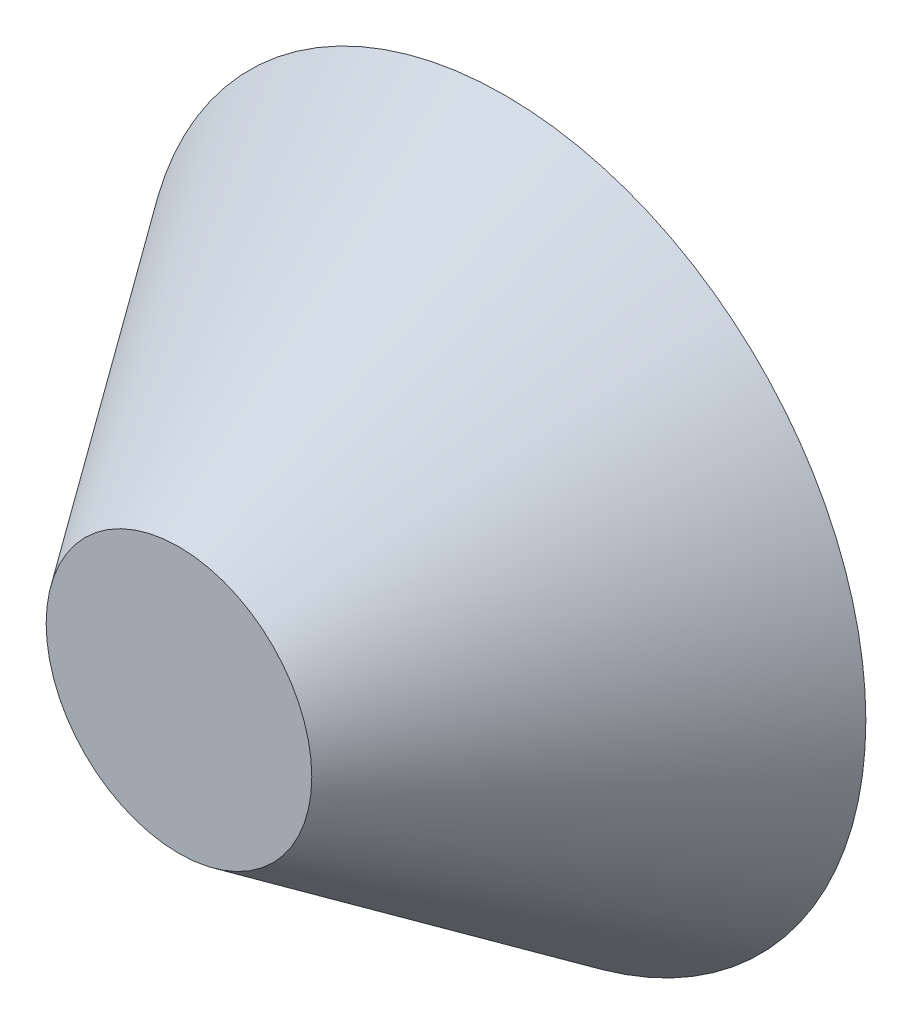
ISO-10303-21;
HEADER;
FILE_DESCRIPTION(('STEP AP214'),'2;1');
FILE_NAME('part.step','',(''),(''),'','','');
FILE_SCHEMA(('AUTOMOTIVE_DESIGN { 1 0 10303 214 1 1 1 1 }'));
ENDSEC;
DATA;
#1=APPLICATION_CONTEXT('core data for automotive mechanical design processes');
#2=APPLICATION_PROTOCOL_DEFINITION('international standard','automotive_design',2000,#1);
#3=PRODUCT_CONTEXT('',#1,'mechanical');
#4=PRODUCT('Part','Part','',(#3));
#5=PRODUCT_RELATED_PRODUCT_CATEGORY('part','',(#4));
#6=PRODUCT_DEFINITION_FORMATION('','',#4);
#7=PRODUCT_DEFINITION_CONTEXT('part definition',#1,'design');
#8=PRODUCT_DEFINITION('design','',#6,#7);
#9=PRODUCT_DEFINITION_SHAPE('','',#8);
#10=(LENGTH_UNIT() NAMED_UNIT(*) SI_UNIT(.MILLI.,.METRE.));
#11=(NAMED_UNIT(*) PLANE_ANGLE_UNIT() SI_UNIT($,.RADIAN.));
#12=(NAMED_UNIT(*) SI_UNIT($,.STERADIAN.) SOLID_ANGLE_UNIT());
#13=UNCERTAINTY_MEASURE_WITH_UNIT(LENGTH_MEASURE(1.E-05),#10,'distance_accuracy_value','');
#14=(GEOMETRIC_REPRESENTATION_CONTEXT(3) GLOBAL_UNCERTAINTY_ASSIGNED_CONTEXT((#13)) GLOBAL_UNIT_ASSIGNED_CONTEXT((#10,
#11,#12)) REPRESENTATION_CONTEXT('',''));
#15=CARTESIAN_POINT('',(0.,0.,0.));
#16=DIRECTION('',(0.,0.,1.));
#17=DIRECTION('',(1.,0.,0.));
#18=AXIS2_PLACEMENT_3D('',#15,#16,#17);
#19=CARTESIAN_POINT('',(-0.032996142,-0.032996142,0.23));
#20=DIRECTION('',(0.,0.,1.));
#21=DIRECTION('',(1.,0.,0.));
#22=AXIS2_PLACEMENT_3D('',#19,#20,#21);
#23=PLANE('',#22);
#24=CARTESIAN_POINT('',(0.,0.,0.22999999998774));
#25=DIRECTION('',(0.,0.,-1.));
#26=DIRECTION('',(-1.,0.,0.));
#27=AXIS2_PLACEMENT_3D('',#24,#25,#26);
#28=CIRCLE('',#27,0.0326048839269788);
#29=CARTESIAN_POINT('',(-0.0326048839269788,0.,0.22999999998774));
#30=VERTEX_POINT('',#29);
#31=EDGE_CURVE('E18',#30,#30,#28,.T.);
#32=ORIENTED_EDGE('',*,*,#31,.F.);
#33=EDGE_LOOP('',(#32));
#34=FACE_BOUND('',#33,.T.);
#35=ADVANCED_FACE('F15',(#34),#23,.T.);
#36=CARTESIAN_POINT('',(0.,0.,0.14999999984866));
#37=DIRECTION('',(0.,0.,-1.));
#38=DIRECTION('',(-1.,0.,0.));
#39=AXIS2_PLACEMENT_3D('',#36,#37,#38);
#40=CONICAL_SURFACE('',#39,0.0886214870092772,0.610865237595254);
#41=CARTESIAN_POINT('',(0.,0.,0.149999999962347));
#42=DIRECTION('',(0.,0.,-1.));
#43=DIRECTION('',(-1.,0.,0.));
#44=AXIS2_PLACEMENT_3D('',#41,#42,#43);
#45=CIRCLE('',#44,0.0886214869296728);
#46=CARTESIAN_POINT('',(-0.0886214869296728,0.,0.149999999962347));
#47=VERTEX_POINT('',#46);
#48=EDGE_CURVE('E10',#47,#47,#45,.F.);
#49=ORIENTED_EDGE('',*,*,#48,.T.);
#50=EDGE_LOOP('',(#49));
#51=FACE_BOUND('',#50,.T.);
#52=ORIENTED_EDGE('',*,*,#31,.T.);
#53=EDGE_LOOP('',(#52));
#54=FACE_BOUND('',#53,.T.);
#55=ADVANCED_FACE('F27',(#51,#54),#40,.T.);
#56=CARTESIAN_POINT('',(-0.089684945,-0.089684945,0.15));
#57=DIRECTION('',(0.,0.,1.));
#58=DIRECTION('',(1.,0.,0.));
#59=AXIS2_PLACEMENT_3D('',#56,#57,#58);
#60=PLANE('',#59);
#61=ORIENTED_EDGE('',*,*,#48,.F.);
#62=EDGE_LOOP('',(#61));
#63=FACE_BOUND('',#62,.T.);
#64=ADVANCED_FACE('F34',(#63),#60,.F.);
#65=CLOSED_SHELL('',(#35,#55,#64));
#66=MANIFOLD_SOLID_BREP('B1',#65);
#67=ADVANCED_BREP_SHAPE_REPRESENTATION('',(#18,#66),#14);
#68=SHAPE_DEFINITION_REPRESENTATION(#9,#67);
ENDSEC;
END-ISO-10303-21;
